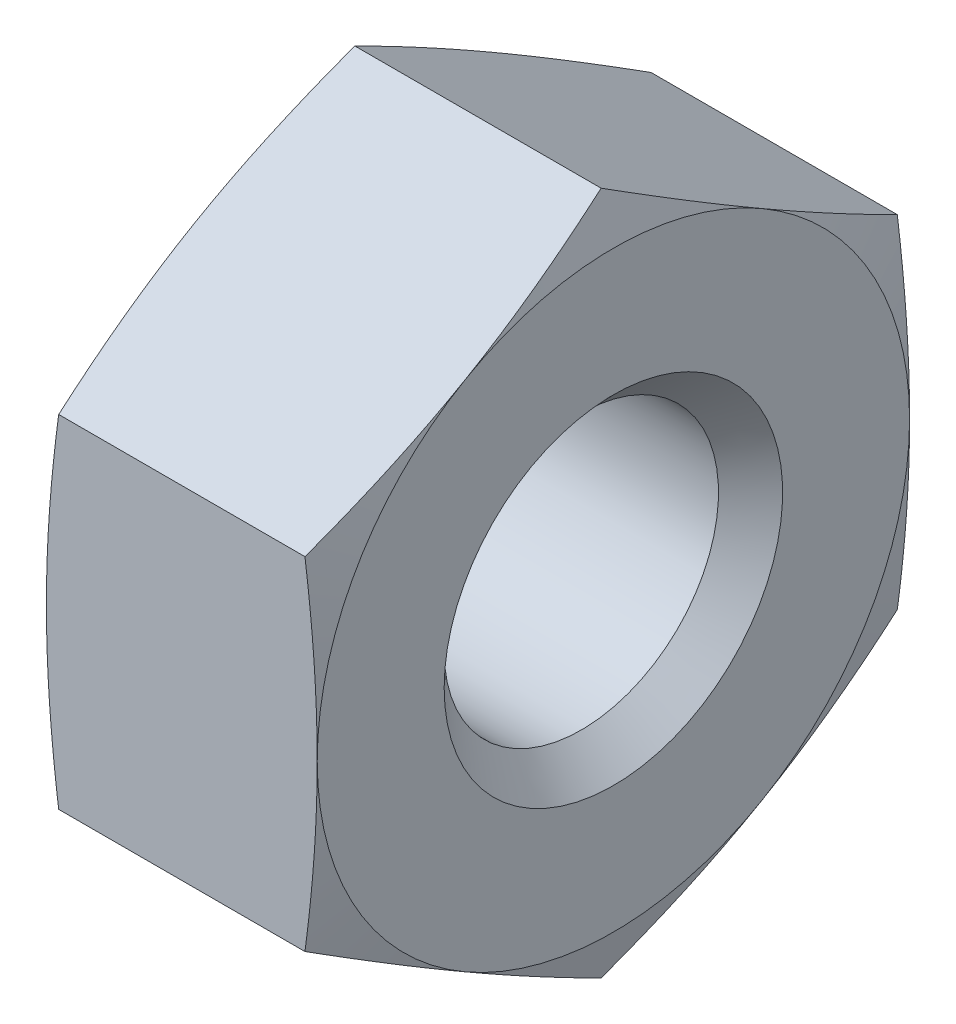
ISO-10303-21;
HEADER;
FILE_DESCRIPTION(('STEP AP214'),'2;1');
FILE_NAME('part.step','',(''),(''),'','','');
FILE_SCHEMA(('AUTOMOTIVE_DESIGN { 1 0 10303 214 1 1 1 1 }'));
ENDSEC;
DATA;
#1=APPLICATION_CONTEXT('core data for automotive mechanical design processes');
#2=APPLICATION_PROTOCOL_DEFINITION('international standard','automotive_design',2000,#1);
#3=PRODUCT_CONTEXT('',#1,'mechanical');
#4=PRODUCT('Part','Part','',(#3));
#5=PRODUCT_RELATED_PRODUCT_CATEGORY('part','',(#4));
#6=PRODUCT_DEFINITION_FORMATION('','',#4);
#7=PRODUCT_DEFINITION_CONTEXT('part definition',#1,'design');
#8=PRODUCT_DEFINITION('design','',#6,#7);
#9=PRODUCT_DEFINITION_SHAPE('','',#8);
#10=(LENGTH_UNIT() NAMED_UNIT(*) SI_UNIT(.MILLI.,.METRE.));
#11=(NAMED_UNIT(*) PLANE_ANGLE_UNIT() SI_UNIT($,.RADIAN.));
#12=(NAMED_UNIT(*) SI_UNIT($,.STERADIAN.) SOLID_ANGLE_UNIT());
#13=UNCERTAINTY_MEASURE_WITH_UNIT(LENGTH_MEASURE(1.E-05),#10,'distance_accuracy_value','');
#14=(GEOMETRIC_REPRESENTATION_CONTEXT(3) GLOBAL_UNCERTAINTY_ASSIGNED_CONTEXT((#13)) GLOBAL_UNIT_ASSIGNED_CONTEXT((#10,
#11,#12)) REPRESENTATION_CONTEXT('',''));
#15=CARTESIAN_POINT('',(0.,0.,0.));
#16=DIRECTION('',(0.,0.,1.));
#17=DIRECTION('',(1.,0.,0.));
#18=AXIS2_PLACEMENT_3D('',#15,#16,#17);
#19=CARTESIAN_POINT('',(-1.41243556529821,0.,0.));
#20=DIRECTION('',(1.,0.,0.));
#21=DIRECTION('',(0.,0.,-1.));
#22=AXIS2_PLACEMENT_3D('',#19,#20,#21);
#23=CONICAL_SURFACE('',#22,4.2,1.30899693899575);
#24=CARTESIAN_POINT('',(-0.825774080769455,-5.3455661320004,-3.5));
#25=CARTESIAN_POINT('',(-0.861360202240099,-5.18678114563824,-3.5));
#26=CARTESIAN_POINT('',(-0.896510445753242,-5.02789691141848,-3.5));
#27=CARTESIAN_POINT('',(-0.965705585660819,-4.70988103803526,-3.5));
#28=CARTESIAN_POINT('',(-0.9997504343165,-4.55074938849684,-3.5));
#29=CARTESIAN_POINT('',(-1.06653082110248,-4.23204722615718,-3.5));
#30=CARTESIAN_POINT('',(-1.09926504210674,-4.07247643597971,-3.5));
#31=CARTESIAN_POINT('',(-1.16306421152616,-3.75300326246381,-3.5));
#32=CARTESIAN_POINT('',(-1.19412917402961,-3.5931008819358,-3.5));
#33=CARTESIAN_POINT('',(-1.28378237158869,-3.11536923669083,-3.5));
#34=CARTESIAN_POINT('',(-1.33937462224755,-2.7969665823393,-3.5));
#35=CARTESIAN_POINT('',(-1.43824247623802,-2.15821816166541,-3.5));
#36=CARTESIAN_POINT('',(-1.48152020199654,-1.83787273991409,-3.5));
#37=CARTESIAN_POINT('',(-1.53305506921513,-1.35406191552193,-3.5));
#38=CARTESIAN_POINT('',(-1.54804894029897,-1.19131720521593,-3.5));
#39=CARTESIAN_POINT('',(-1.57266491038951,-0.865417075062547,-3.5));
#40=CARTESIAN_POINT('',(-1.58228713258986,-0.702261664720382,-3.5));
#41=CARTESIAN_POINT('',(-1.59560015595098,-0.375778787142295,-3.5));
#42=CARTESIAN_POINT('',(-1.59929365257278,-0.212451431896808,-3.5));
#43=CARTESIAN_POINT('',(-1.60052170001637,0.114226872120972,-3.5));
#44=CARTESIAN_POINT('',(-1.59805625614729,0.277577820872805,-3.5));
#45=CARTESIAN_POINT('',(-1.58710536677282,0.604665466025193,-3.5));
#46=CARTESIAN_POINT('',(-1.57859816890971,0.768401419243445,-3.5));
#47=CARTESIAN_POINT('',(-1.55604871274712,1.0954934251131,-3.5));
#48=CARTESIAN_POINT('',(-1.5420061543352,1.25884945668304,-3.5));
#49=CARTESIAN_POINT('',(-1.50909696140663,1.5851727966074,-3.5));
#50=CARTESIAN_POINT('',(-1.49022725581786,1.74813979058414,-3.5));
#51=CARTESIAN_POINT('',(-1.44844379186519,2.07354796221386,-3.5));
#52=CARTESIAN_POINT('',(-1.42553002080452,2.23598913821436,-3.5));
#53=CARTESIAN_POINT('',(-1.35510376185541,2.70107424154032,-3.5));
#54=CARTESIAN_POINT('',(-1.30349609986563,3.00309502608456,-3.5));
#55=CARTESIAN_POINT('',(-1.19263699683484,3.60573006421075,-3.5));
#56=CARTESIAN_POINT('',(-1.13338458654066,3.90634413442305,-3.5));
#57=CARTESIAN_POINT('',(-1.00974779112105,4.50658311308096,-3.5));
#58=CARTESIAN_POINT('',(-0.945362163628684,4.80620776367716,-3.5));
#59=CARTESIAN_POINT('',(-0.813098909194716,5.4046608471849,-3.5));
#60=CARTESIAN_POINT('',(-0.745221486521148,5.70348932559883,-3.5));
#61=CARTESIAN_POINT('',(-0.607691774971723,6.29764252059795,-3.5));
#62=CARTESIAN_POINT('',(-0.538063481001438,6.59297281204217,-3.5));
#63=CARTESIAN_POINT('',(-0.397063271598534,7.18322142520436,-3.5));
#64=CARTESIAN_POINT('',(-0.325691324401068,7.47813973931354,-3.5));
#65=CARTESIAN_POINT('',(-0.1817484400772,8.06729730832213,-3.5));
#66=CARTESIAN_POINT('',(-0.109179091229992,8.36153695209043,-3.5));
#67=CARTESIAN_POINT('',(0.0369505240143286,8.94975993868972,-3.5));
#68=CARTESIAN_POINT('',(0.110510757631055,9.24374328965846,-3.5));
#69=CARTESIAN_POINT('',(0.184421960074827,9.53763731936475,-3.5));
#70=B_SPLINE_CURVE_WITH_KNOTS('',3,(#24,#25,#26,#27,#28,#29,#30,#31,#32,#33,#34,#35,#36,#37,#38,
#39,#40,#41,#42,#43,#44,#45,#46,#47,#48,#49,#50,#51,#52,#53,#54,#55,#56,#57,#58,#59,#60,#61,#62,
#63,#64,#65,#66,#67,#68,#69),.UNSPECIFIED.,.F.,.F.,(4,2,2,2,2,2,2,2,2,2,2,2,2,2,2,2,2,2,2,2,2,2,
4),(0.,0.488173047170685,0.976367149132463,1.46504014431117,1.95370901451417,2.92322875453118,
3.89258129500769,4.38280901112369,4.87302548387088,5.36301901932391,5.85301213239303,
6.34477838866378,6.83657131085366,7.32867789741848,7.82078602903244,8.73980806610427,
9.65894673775297,10.5783085432182,11.4976166275648,12.40789115114,13.3181822699437,
14.2273500606709,15.1364878478763),.UNSPECIFIED.);
#71=CARTESIAN_POINT('',(-1.45491840485417,-2.02072594216369,-3.5));
#72=VERTEX_POINT('',#71);
#73=CARTESIAN_POINT('',(-1.6,0.,-3.5));
#74=VERTEX_POINT('',#73);
#75=EDGE_CURVE('E202',#72,#74,#70,.T.);
#76=ORIENTED_EDGE('',*,*,#75,.F.);
#77=CARTESIAN_POINT('',(-1.45488746342053,-4.04156735438122,0.000200000000000065));
#78=CARTESIAN_POINT('',(-1.47738559382201,-3.95764212282385,-0.145162765094347));
#79=CARTESIAN_POINT('',(-1.49781025450598,-3.87356471593575,-0.290789105593173));
#80=CARTESIAN_POINT('',(-1.53369455339474,-3.70511294932748,-0.582556123983438));
#81=CARTESIAN_POINT('',(-1.54915217450553,-3.62073848299856,-0.728696986526636));
#82=CARTESIAN_POINT('',(-1.57419991225358,-3.45220420868617,-1.02060691245244));
#83=CARTESIAN_POINT('',(-1.58381990209048,-3.3680455405573,-1.16637400154898));
#84=CARTESIAN_POINT('',(-1.59671933246686,-3.19962087008055,-1.45809408806274));
#85=CARTESIAN_POINT('',(-1.6,-3.11535489166305,-1.60404704403137));
#86=CARTESIAN_POINT('',(-1.6,-2.94682293482803,-1.89595295596863));
#87=CARTESIAN_POINT('',(-1.59671933246686,-2.86255695641052,-2.04190591193726));
#88=CARTESIAN_POINT('',(-1.58381990209048,-2.69413228593377,-2.33362599845102));
#89=CARTESIAN_POINT('',(-1.57419991225358,-2.6099736178049,-2.47939308754755));
#90=CARTESIAN_POINT('',(-1.54915217450552,-2.44143934349251,-2.77130301347336));
#91=CARTESIAN_POINT('',(-1.53369455339473,-2.35706487716359,-2.91744387601656));
#92=CARTESIAN_POINT('',(-1.49781025450598,-2.18861311055532,-3.20921089440683));
#93=CARTESIAN_POINT('',(-1.47738559382201,-2.10453570366722,-3.35483723490565));
#94=CARTESIAN_POINT('',(-1.45488746342053,-2.02061047210985,-3.5002));
#95=B_SPLINE_CURVE_WITH_KNOTS('',3,(#77,#78,#79,#80,#81,#82,#83,#84,#85,#86,#87,#88,#89,#90,#91,
#92,#93,#94),.UNSPECIFIED.,.F.,.F.,(4,2,2,2,2,2,2,2,4),(0.,0.508081243376833,1.01636855642799,
1.52203235492776,2.02759827097034,2.53316418701292,3.03882798551268,3.54711529856384,
4.05519654194067),.UNSPECIFIED.);
#96=CARTESIAN_POINT('',(-1.6,-3.03108891324554,-1.75));
#97=VERTEX_POINT('',#96);
#98=EDGE_CURVE('E182',#97,#72,#95,.T.);
#99=ORIENTED_EDGE('',*,*,#98,.F.);
#100=CARTESIAN_POINT('',(-1.6,0.,0.));
#101=DIRECTION('',(-1.,0.,0.));
#102=DIRECTION('',(0.,0.,1.));
#103=AXIS2_PLACEMENT_3D('',#100,#101,#102);
#104=CIRCLE('',#103,3.5);
#105=EDGE_CURVE('E279',#74,#97,#104,.T.);
#106=ORIENTED_EDGE('',*,*,#105,.F.);
#107=EDGE_LOOP('',(#76,#99,#106));
#108=FACE_BOUND('',#107,.T.);
#109=ADVANCED_FACE('F36',(#108),#23,.T.);
#110=CARTESIAN_POINT('',(-1.45491840485417,2.02072594216369,-3.5));
#111=VERTEX_POINT('',#110);
#112=EDGE_CURVE('E189',#74,#111,#70,.T.);
#113=ORIENTED_EDGE('',*,*,#112,.F.);
#114=CARTESIAN_POINT('',(-1.6,3.03108891324554,-1.75));
#115=VERTEX_POINT('',#114);
#116=EDGE_CURVE('E280',#115,#74,#104,.T.);
#117=ORIENTED_EDGE('',*,*,#116,.F.);
#118=CARTESIAN_POINT('',(-1.45488746342053,2.02061047210985,-3.5002));
#119=CARTESIAN_POINT('',(-1.47738559382201,2.10453570366722,-3.35483723490565));
#120=CARTESIAN_POINT('',(-1.49781025450598,2.18861311055532,-3.20921089440683));
#121=CARTESIAN_POINT('',(-1.53369455339473,2.35706487716359,-2.91744387601656));
#122=CARTESIAN_POINT('',(-1.54915217450552,2.44143934349251,-2.77130301347336));
#123=CARTESIAN_POINT('',(-1.57419991225358,2.6099736178049,-2.47939308754755));
#124=CARTESIAN_POINT('',(-1.58381990209048,2.69413228593377,-2.33362599845102));
#125=CARTESIAN_POINT('',(-1.59671933246686,2.86255695641052,-2.04190591193726));
#126=CARTESIAN_POINT('',(-1.6,2.94682293482803,-1.89595295596863));
#127=CARTESIAN_POINT('',(-1.6,3.11535489166304,-1.60404704403137));
#128=CARTESIAN_POINT('',(-1.59671933246686,3.19962087008055,-1.45809408806274));
#129=CARTESIAN_POINT('',(-1.58381990209048,3.3680455405573,-1.16637400154898));
#130=CARTESIAN_POINT('',(-1.57419991225358,3.45220420868617,-1.02060691245244));
#131=CARTESIAN_POINT('',(-1.54915217450553,3.62073848299856,-0.728696986526636));
#132=CARTESIAN_POINT('',(-1.53369455339473,3.70511294932748,-0.582556123983438));
#133=CARTESIAN_POINT('',(-1.49781025450598,3.87356471593575,-0.290789105593172));
#134=CARTESIAN_POINT('',(-1.47738559382201,3.95764212282385,-0.145162765094346));
#135=CARTESIAN_POINT('',(-1.45488746342053,4.04156735438122,0.000200000000000213));
#136=B_SPLINE_CURVE_WITH_KNOTS('',3,(#118,#119,#120,#121,#122,#123,#124,#125,#126,#127,#128,
#129,#130,#131,#132,#133,#134,#135),.UNSPECIFIED.,.F.,.F.,(4,2,2,2,2,2,2,2,4),(0.,
0.508081243376834,1.016368556428,1.52203235492776,2.02759827097034,2.53316418701292,
3.03882798551268,3.54711529856384,4.05519654194067),.UNSPECIFIED.);
#137=EDGE_CURVE('E141',#111,#115,#136,.T.);
#138=ORIENTED_EDGE('',*,*,#137,.F.);
#139=EDGE_LOOP('',(#113,#117,#138));
#140=FACE_BOUND('',#139,.T.);
#141=ADVANCED_FACE('F171',(#140),#23,.T.);
#142=CARTESIAN_POINT('',(-1.45491840485417,4.04145188432738,0.));
#143=VERTEX_POINT('',#142);
#144=EDGE_CURVE('E196',#115,#143,#136,.T.);
#145=ORIENTED_EDGE('',*,*,#144,.F.);
#146=CARTESIAN_POINT('',(-1.6,3.03108891324554,1.75));
#147=VERTEX_POINT('',#146);
#148=EDGE_CURVE('E282',#147,#115,#104,.T.);
#149=ORIENTED_EDGE('',*,*,#148,.F.);
#150=CARTESIAN_POINT('',(-1.45488746342053,4.04156735438122,-0.000200000000000065));
#151=CARTESIAN_POINT('',(-1.47738559382201,3.95764212282385,0.145162765094347));
#152=CARTESIAN_POINT('',(-1.49781025450598,3.87356471593575,0.290789105593173));
#153=CARTESIAN_POINT('',(-1.53369455339474,3.70511294932748,0.582556123983438));
#154=CARTESIAN_POINT('',(-1.54915217450553,3.62073848299856,0.728696986526636));
#155=CARTESIAN_POINT('',(-1.57419991225358,3.45220420868617,1.02060691245244));
#156=CARTESIAN_POINT('',(-1.58381990209048,3.3680455405573,1.16637400154898));
#157=CARTESIAN_POINT('',(-1.59671933246686,3.19962087008055,1.45809408806274));
#158=CARTESIAN_POINT('',(-1.6,3.11535489166305,1.60404704403137));
#159=CARTESIAN_POINT('',(-1.6,2.94682293482803,1.89595295596863));
#160=CARTESIAN_POINT('',(-1.59671933246686,2.86255695641052,2.04190591193726));
#161=CARTESIAN_POINT('',(-1.58381990209048,2.69413228593377,2.33362599845102));
#162=CARTESIAN_POINT('',(-1.57419991225358,2.6099736178049,2.47939308754755));
#163=CARTESIAN_POINT('',(-1.54915217450552,2.44143934349251,2.77130301347336));
#164=CARTESIAN_POINT('',(-1.53369455339473,2.35706487716359,2.91744387601656));
#165=CARTESIAN_POINT('',(-1.49781025450598,2.18861311055532,3.20921089440683));
#166=CARTESIAN_POINT('',(-1.47738559382201,2.10453570366722,3.35483723490565));
#167=CARTESIAN_POINT('',(-1.45488746342053,2.02061047210985,3.5002));
#168=B_SPLINE_CURVE_WITH_KNOTS('',3,(#150,#151,#152,#153,#154,#155,#156,#157,#158,#159,#160,
#161,#162,#163,#164,#165,#166,#167),.UNSPECIFIED.,.F.,.F.,(4,2,2,2,2,2,2,2,4),(0.,
0.508081243376833,1.01636855642799,1.52203235492776,2.02759827097034,2.53316418701292,
3.03882798551268,3.54711529856384,4.05519654194067),.UNSPECIFIED.);
#169=EDGE_CURVE('E137',#143,#147,#168,.T.);
#170=ORIENTED_EDGE('',*,*,#169,.F.);
#171=EDGE_LOOP('',(#145,#149,#170));
#172=FACE_BOUND('',#171,.T.);
#173=ADVANCED_FACE('F351',(#172),#23,.T.);
#174=CARTESIAN_POINT('',(-1.45491840485417,-4.04145188432738,0.));
#175=VERTEX_POINT('',#174);
#176=EDGE_CURVE('E270',#175,#97,#95,.T.);
#177=ORIENTED_EDGE('',*,*,#176,.F.);
#178=CARTESIAN_POINT('',(-1.45488746342053,-2.02061047210985,3.5002));
#179=CARTESIAN_POINT('',(-1.47738559382201,-2.10453570366722,3.35483723490565));
#180=CARTESIAN_POINT('',(-1.49781025450598,-2.18861311055532,3.20921089440683));
#181=CARTESIAN_POINT('',(-1.53369455339473,-2.35706487716359,2.91744387601656));
#182=CARTESIAN_POINT('',(-1.54915217450552,-2.44143934349251,2.77130301347336));
#183=CARTESIAN_POINT('',(-1.57419991225358,-2.6099736178049,2.47939308754755));
#184=CARTESIAN_POINT('',(-1.58381990209048,-2.69413228593377,2.33362599845102));
#185=CARTESIAN_POINT('',(-1.59671933246686,-2.86255695641052,2.04190591193726));
#186=CARTESIAN_POINT('',(-1.6,-2.94682293482803,1.89595295596863));
#187=CARTESIAN_POINT('',(-1.6,-3.11535489166304,1.60404704403137));
#188=CARTESIAN_POINT('',(-1.59671933246686,-3.19962087008055,1.45809408806274));
#189=CARTESIAN_POINT('',(-1.58381990209048,-3.3680455405573,1.16637400154898));
#190=CARTESIAN_POINT('',(-1.57419991225358,-3.45220420868617,1.02060691245244));
#191=CARTESIAN_POINT('',(-1.54915217450553,-3.62073848299856,0.728696986526636));
#192=CARTESIAN_POINT('',(-1.53369455339473,-3.70511294932748,0.582556123983438));
#193=CARTESIAN_POINT('',(-1.49781025450598,-3.87356471593575,0.290789105593172));
#194=CARTESIAN_POINT('',(-1.47738559382201,-3.95764212282385,0.145162765094346));
#195=CARTESIAN_POINT('',(-1.45488746342053,-4.04156735438122,-0.000200000000000213));
#196=B_SPLINE_CURVE_WITH_KNOTS('',3,(#178,#179,#180,#181,#182,#183,#184,#185,#186,#187,#188,
#189,#190,#191,#192,#193,#194,#195),.UNSPECIFIED.,.F.,.F.,(4,2,2,2,2,2,2,2,4),(0.,
0.508081243376834,1.016368556428,1.52203235492776,2.02759827097034,2.53316418701292,
3.03882798551268,3.54711529856384,4.05519654194067),.UNSPECIFIED.);
#197=CARTESIAN_POINT('',(-1.6,-3.03108891324554,1.75));
#198=VERTEX_POINT('',#197);
#199=EDGE_CURVE('E150',#198,#175,#196,.T.);
#200=ORIENTED_EDGE('',*,*,#199,.F.);
#201=EDGE_CURVE('E268',#97,#198,#104,.T.);
#202=ORIENTED_EDGE('',*,*,#201,.F.);
#203=EDGE_LOOP('',(#177,#200,#202));
#204=FACE_BOUND('',#203,.T.);
#205=ADVANCED_FACE('F266',(#204),#23,.T.);
#206=CARTESIAN_POINT('',(-1.45491840485417,2.02072594216369,3.5));
#207=VERTEX_POINT('',#206);
#208=EDGE_CURVE('E131',#147,#207,#168,.T.);
#209=ORIENTED_EDGE('',*,*,#208,.F.);
#210=CARTESIAN_POINT('',(-1.6,0.,3.5));
#211=VERTEX_POINT('',#210);
#212=EDGE_CURVE('E149',#211,#147,#104,.T.);
#213=ORIENTED_EDGE('',*,*,#212,.F.);
#214=CARTESIAN_POINT('',(-0.825774080769455,-5.3455661320004,3.5));
#215=CARTESIAN_POINT('',(-0.861360202240099,-5.18678114563824,3.5));
#216=CARTESIAN_POINT('',(-0.896510445753242,-5.02789691141848,3.5));
#217=CARTESIAN_POINT('',(-0.965705585660819,-4.70988103803526,3.5));
#218=CARTESIAN_POINT('',(-0.9997504343165,-4.55074938849684,3.5));
#219=CARTESIAN_POINT('',(-1.06653082110248,-4.23204722615718,3.5));
#220=CARTESIAN_POINT('',(-1.09926504210674,-4.07247643597971,3.5));
#221=CARTESIAN_POINT('',(-1.16306421152616,-3.75300326246381,3.5));
#222=CARTESIAN_POINT('',(-1.19412917402961,-3.5931008819358,3.5));
#223=CARTESIAN_POINT('',(-1.28378237158869,-3.11536923669083,3.5));
#224=CARTESIAN_POINT('',(-1.33937462224755,-2.7969665823393,3.5));
#225=CARTESIAN_POINT('',(-1.43824247623802,-2.15821816166541,3.5));
#226=CARTESIAN_POINT('',(-1.48152020199654,-1.83787273991409,3.5));
#227=CARTESIAN_POINT('',(-1.53305506921513,-1.35406191552193,3.5));
#228=CARTESIAN_POINT('',(-1.54804894029897,-1.19131720521593,3.5));
#229=CARTESIAN_POINT('',(-1.57266491038951,-0.865417075062547,3.5));
#230=CARTESIAN_POINT('',(-1.58228713258986,-0.702261664720382,3.5));
#231=CARTESIAN_POINT('',(-1.59560015595098,-0.375778787142295,3.5));
#232=CARTESIAN_POINT('',(-1.59929365257278,-0.212451431896808,3.5));
#233=CARTESIAN_POINT('',(-1.60052170001637,0.114226872120972,3.5));
#234=CARTESIAN_POINT('',(-1.59805625614729,0.277577820872805,3.5));
#235=CARTESIAN_POINT('',(-1.58710536677282,0.604665466025193,3.5));
#236=CARTESIAN_POINT('',(-1.57859816890971,0.768401419243445,3.5));
#237=CARTESIAN_POINT('',(-1.55604871274712,1.0954934251131,3.5));
#238=CARTESIAN_POINT('',(-1.5420061543352,1.25884945668304,3.5));
#239=CARTESIAN_POINT('',(-1.50909696140663,1.5851727966074,3.5));
#240=CARTESIAN_POINT('',(-1.49022725581786,1.74813979058414,3.5));
#241=CARTESIAN_POINT('',(-1.44844379186519,2.07354796221386,3.5));
#242=CARTESIAN_POINT('',(-1.42553002080452,2.23598913821436,3.5));
#243=CARTESIAN_POINT('',(-1.35510376185541,2.70107424154032,3.5));
#244=CARTESIAN_POINT('',(-1.30349609986563,3.00309502608456,3.5));
#245=CARTESIAN_POINT('',(-1.19263699683484,3.60573006421075,3.5));
#246=CARTESIAN_POINT('',(-1.13338458654066,3.90634413442305,3.5));
#247=CARTESIAN_POINT('',(-1.00974779112105,4.50658311308096,3.5));
#248=CARTESIAN_POINT('',(-0.945362163628684,4.80620776367716,3.5));
#249=CARTESIAN_POINT('',(-0.813098909194716,5.4046608471849,3.5));
#250=CARTESIAN_POINT('',(-0.745221486521148,5.70348932559883,3.5));
#251=CARTESIAN_POINT('',(-0.607691774971723,6.29764252059795,3.5));
#252=CARTESIAN_POINT('',(-0.538063481001438,6.59297281204217,3.5));
#253=CARTESIAN_POINT('',(-0.397063271598534,7.18322142520436,3.5));
#254=CARTESIAN_POINT('',(-0.325691324401068,7.47813973931354,3.5));
#255=CARTESIAN_POINT('',(-0.1817484400772,8.06729730832213,3.5));
#256=CARTESIAN_POINT('',(-0.109179091229992,8.36153695209043,3.5));
#257=CARTESIAN_POINT('',(0.0369505240143286,8.94975993868972,3.5));
#258=CARTESIAN_POINT('',(0.110510757631055,9.24374328965846,3.5));
#259=CARTESIAN_POINT('',(0.184421960074827,9.53763731936475,3.5));
#260=B_SPLINE_CURVE_WITH_KNOTS('',3,(#214,#215,#216,#217,#218,#219,#220,#221,#222,#223,#224,
#225,#226,#227,#228,#229,#230,#231,#232,#233,#234,#235,#236,#237,#238,#239,#240,#241,#242,#243,
#244,#245,#246,#247,#248,#249,#250,#251,#252,#253,#254,#255,#256,#257,#258,#259),.UNSPECIFIED.,
.F.,.F.,(4,2,2,2,2,2,2,2,2,2,2,2,2,2,2,2,2,2,2,2,2,2,4),(0.,0.488173047170685,0.976367149132463,
1.46504014431117,1.95370901451417,2.92322875453118,3.89258129500769,4.38280901112369,
4.87302548387088,5.36301901932391,5.85301213239303,6.34477838866378,6.83657131085366,
7.32867789741848,7.82078602903244,8.73980806610427,9.65894673775297,10.5783085432182,
11.4976166275648,12.40789115114,13.3181822699437,14.2273500606709,15.1364878478763),.UNSPECIFIED.);
#261=EDGE_CURVE('E57',#207,#211,#260,.F.);
#262=ORIENTED_EDGE('',*,*,#261,.F.);
#263=EDGE_LOOP('',(#209,#213,#262));
#264=FACE_BOUND('',#263,.T.);
#265=ADVANCED_FACE('F147',(#264),#23,.T.);
#266=CARTESIAN_POINT('',(-1.45491840485417,-2.02072594216369,3.5));
#267=VERTEX_POINT('',#266);
#268=EDGE_CURVE('E153',#267,#198,#196,.T.);
#269=ORIENTED_EDGE('',*,*,#268,.F.);
#270=EDGE_CURVE('E151',#211,#267,#260,.F.);
#271=ORIENTED_EDGE('',*,*,#270,.F.);
#272=EDGE_CURVE('E272',#198,#211,#104,.T.);
#273=ORIENTED_EDGE('',*,*,#272,.F.);
#274=EDGE_LOOP('',(#269,#271,#273));
#275=FACE_BOUND('',#274,.T.);
#276=ADVANCED_FACE('F173',(#275),#23,.T.);
#277=CARTESIAN_POINT('',(1.6,0.,0.));
#278=DIRECTION('',(-1.,0.,0.));
#279=DIRECTION('',(0.,0.,1.));
#280=AXIS2_PLACEMENT_3D('',#277,#278,#279);
#281=CONICAL_SURFACE('',#280,3.5,1.30899693899575);
#282=CARTESIAN_POINT('',(1.45488746342053,2.02061047210985,3.5002));
#283=CARTESIAN_POINT('',(1.47738559382201,2.10453570366722,3.35483723490565));
#284=CARTESIAN_POINT('',(1.49781025450598,2.18861311055532,3.20921089440683));
#285=CARTESIAN_POINT('',(1.53369455339473,2.35706487716359,2.91744387601656));
#286=CARTESIAN_POINT('',(1.54915217450553,2.44143934349251,2.77130301347336));
#287=CARTESIAN_POINT('',(1.57419991225358,2.6099736178049,2.47939308754755));
#288=CARTESIAN_POINT('',(1.58381990209048,2.69413228593377,2.33362599845102));
#289=CARTESIAN_POINT('',(1.59671933246686,2.86255695641052,2.04190591193726));
#290=CARTESIAN_POINT('',(1.6,2.94682293482803,1.89595295596863));
#291=CARTESIAN_POINT('',(1.6,3.11535489166305,1.60404704403137));
#292=CARTESIAN_POINT('',(1.59671933246686,3.19962087008055,1.45809408806274));
#293=CARTESIAN_POINT('',(1.58381990209048,3.3680455405573,1.16637400154898));
#294=CARTESIAN_POINT('',(1.57419991225358,3.45220420868617,1.02060691245245));
#295=CARTESIAN_POINT('',(1.54915217450553,3.62073848299856,0.728696986526637));
#296=CARTESIAN_POINT('',(1.53369455339474,3.70511294932748,0.582556123983438));
#297=CARTESIAN_POINT('',(1.49781025450598,3.87356471593575,0.290789105593173));
#298=CARTESIAN_POINT('',(1.47738559382201,3.95764212282385,0.145162765094347));
#299=CARTESIAN_POINT('',(1.45488746342053,4.04156735438122,-0.000199999999999612));
#300=B_SPLINE_CURVE_WITH_KNOTS('',3,(#282,#283,#284,#285,#286,#287,#288,#289,#290,#291,#292,
#293,#294,#295,#296,#297,#298,#299),.UNSPECIFIED.,.F.,.F.,(4,2,2,2,2,2,2,2,4),(0.,
0.508081243376834,1.01636855642799,1.52203235492776,2.02759827097034,2.53316418701292,
3.03882798551268,3.54711529856384,4.05519654194067),.UNSPECIFIED.);
#301=CARTESIAN_POINT('',(1.45491840485417,2.02072594216369,3.5));
#302=VERTEX_POINT('',#301);
#303=CARTESIAN_POINT('',(1.6,3.03108891324554,1.75));
#304=VERTEX_POINT('',#303);
#305=EDGE_CURVE('E11',#302,#304,#300,.T.);
#306=ORIENTED_EDGE('',*,*,#305,.F.);
#307=CARTESIAN_POINT('',(0.825774080769454,-5.3455661320004,3.5));
#308=CARTESIAN_POINT('',(0.861360202240099,-5.18678114563824,3.5));
#309=CARTESIAN_POINT('',(0.896510445753242,-5.02789691141848,3.5));
#310=CARTESIAN_POINT('',(0.965705585660819,-4.70988103803526,3.5));
#311=CARTESIAN_POINT('',(0.9997504343165,-4.55074938849684,3.5));
#312=CARTESIAN_POINT('',(1.06653082110248,-4.23204722615718,3.5));
#313=CARTESIAN_POINT('',(1.09926504210674,-4.07247643597971,3.5));
#314=CARTESIAN_POINT('',(1.16306421152616,-3.75300326246381,3.5));
#315=CARTESIAN_POINT('',(1.19412917402961,-3.5931008819358,3.5));
#316=CARTESIAN_POINT('',(1.28378237158869,-3.11536923669083,3.5));
#317=CARTESIAN_POINT('',(1.33937462224755,-2.7969665823393,3.5));
#318=CARTESIAN_POINT('',(1.43824247623802,-2.15821816166541,3.5));
#319=CARTESIAN_POINT('',(1.48152020199654,-1.83787273991409,3.5));
#320=CARTESIAN_POINT('',(1.53305506921513,-1.35406191552193,3.5));
#321=CARTESIAN_POINT('',(1.54804894029897,-1.19131720521593,3.5));
#322=CARTESIAN_POINT('',(1.57266491038951,-0.865417075062548,3.5));
#323=CARTESIAN_POINT('',(1.58228713258986,-0.702261664720382,3.5));
#324=CARTESIAN_POINT('',(1.59560015595098,-0.375778787142295,3.5));
#325=CARTESIAN_POINT('',(1.59929365257278,-0.212451431896808,3.5));
#326=CARTESIAN_POINT('',(1.60052170001637,0.114226872120972,3.5));
#327=CARTESIAN_POINT('',(1.59805625614729,0.277577820872805,3.5));
#328=CARTESIAN_POINT('',(1.58710536677282,0.604665466025193,3.5));
#329=CARTESIAN_POINT('',(1.57859816890971,0.768401419243445,3.5));
#330=CARTESIAN_POINT('',(1.55604871274712,1.0954934251131,3.5));
#331=CARTESIAN_POINT('',(1.54200615433519,1.25884945668304,3.5));
#332=CARTESIAN_POINT('',(1.50909696140663,1.5851727966074,3.5));
#333=CARTESIAN_POINT('',(1.49022725581786,1.74813979058414,3.5));
#334=CARTESIAN_POINT('',(1.44844379186519,2.07354796221386,3.5));
#335=CARTESIAN_POINT('',(1.42553002080452,2.23598913821436,3.5));
#336=CARTESIAN_POINT('',(1.35510376185541,2.70107424154031,3.5));
#337=CARTESIAN_POINT('',(1.30349609986563,3.00309502608456,3.5));
#338=CARTESIAN_POINT('',(1.19263699683484,3.60573006421074,3.5));
#339=CARTESIAN_POINT('',(1.13338458654066,3.90634413442305,3.5));
#340=CARTESIAN_POINT('',(1.00974779112105,4.50658311308096,3.5));
#341=CARTESIAN_POINT('',(0.945362163628684,4.80620776367716,3.5));
#342=CARTESIAN_POINT('',(0.813098909194716,5.4046608471849,3.5));
#343=CARTESIAN_POINT('',(0.745221486521148,5.70348932559882,3.5));
#344=CARTESIAN_POINT('',(0.607691774971723,6.29764252059795,3.5));
#345=CARTESIAN_POINT('',(0.538063481001439,6.59297281204217,3.5));
#346=CARTESIAN_POINT('',(0.397063271598534,7.18322142520436,3.5));
#347=CARTESIAN_POINT('',(0.325691324401068,7.47813973931354,3.5));
#348=CARTESIAN_POINT('',(0.1817484400772,8.06729730832213,3.5));
#349=CARTESIAN_POINT('',(0.109179091229992,8.36153695209043,3.5));
#350=CARTESIAN_POINT('',(-0.0369505240143283,8.94975993868972,3.5));
#351=CARTESIAN_POINT('',(-0.110510757631055,9.24374328965846,3.5));
#352=CARTESIAN_POINT('',(-0.184421960074828,9.53763731936475,3.5));
#353=B_SPLINE_CURVE_WITH_KNOTS('',3,(#307,#308,#309,#310,#311,#312,#313,#314,#315,#316,#317,
#318,#319,#320,#321,#322,#323,#324,#325,#326,#327,#328,#329,#330,#331,#332,#333,#334,#335,#336,
#337,#338,#339,#340,#341,#342,#343,#344,#345,#346,#347,#348,#349,#350,#351,#352),.UNSPECIFIED.,
.F.,.F.,(4,2,2,2,2,2,2,2,2,2,2,2,2,2,2,2,2,2,2,2,2,2,4),(0.,0.488173047170685,0.976367149132463,
1.46504014431117,1.95370901451417,2.92322875453118,3.89258129500769,4.38280901112369,
4.87302548387087,5.36301901932391,5.85301213239303,6.34477838866378,6.83657131085366,
7.32867789741848,7.82078602903244,8.73980806610426,9.65894673775296,10.5783085432182,
11.4976166275648,12.40789115114,13.3181822699437,14.2273500606709,15.1364878478763),.UNSPECIFIED.);
#354=CARTESIAN_POINT('',(1.6,0.,3.5));
#355=VERTEX_POINT('',#354);
#356=EDGE_CURVE('E144',#355,#302,#353,.T.);
#357=ORIENTED_EDGE('',*,*,#356,.F.);
#358=CARTESIAN_POINT('',(1.6,0.,0.));
#359=DIRECTION('',(-1.,0.,0.));
#360=DIRECTION('',(0.,0.,1.));
#361=AXIS2_PLACEMENT_3D('',#358,#359,#360);
#362=CIRCLE('',#361,3.5);
#363=EDGE_CURVE('E274',#355,#304,#362,.T.);
#364=ORIENTED_EDGE('',*,*,#363,.T.);
#365=EDGE_LOOP('',(#306,#357,#364));
#366=FACE_BOUND('',#365,.T.);
#367=ADVANCED_FACE('F174',(#366),#281,.T.);
#368=CARTESIAN_POINT('',(1.45491840485417,4.04145188432738,0.));
#369=VERTEX_POINT('',#368);
#370=EDGE_CURVE('E40',#304,#369,#300,.T.);
#371=ORIENTED_EDGE('',*,*,#370,.F.);
#372=CARTESIAN_POINT('',(1.6,3.03108891324554,-1.75));
#373=VERTEX_POINT('',#372);
#374=EDGE_CURVE('E317',#304,#373,#362,.T.);
#375=ORIENTED_EDGE('',*,*,#374,.T.);
#376=CARTESIAN_POINT('',(1.45488746342053,4.04156735438122,0.0002));
#377=CARTESIAN_POINT('',(1.47738559382201,3.95764212282385,-0.145162765094347));
#378=CARTESIAN_POINT('',(1.49781025450598,3.87356471593575,-0.290789105593173));
#379=CARTESIAN_POINT('',(1.53369455339474,3.70511294932748,-0.582556123983438));
#380=CARTESIAN_POINT('',(1.54915217450553,3.62073848299856,-0.728696986526637));
#381=CARTESIAN_POINT('',(1.57419991225358,3.45220420868617,-1.02060691245245));
#382=CARTESIAN_POINT('',(1.58381990209048,3.3680455405573,-1.16637400154898));
#383=CARTESIAN_POINT('',(1.59671933246686,3.19962087008055,-1.45809408806274));
#384=CARTESIAN_POINT('',(1.6,3.11535489166304,-1.60404704403137));
#385=CARTESIAN_POINT('',(1.6,2.94682293482803,-1.89595295596863));
#386=CARTESIAN_POINT('',(1.59671933246686,2.86255695641052,-2.04190591193726));
#387=CARTESIAN_POINT('',(1.58381990209048,2.69413228593377,-2.33362599845102));
#388=CARTESIAN_POINT('',(1.57419991225358,2.6099736178049,-2.47939308754755));
#389=CARTESIAN_POINT('',(1.54915217450552,2.44143934349251,-2.77130301347336));
#390=CARTESIAN_POINT('',(1.53369455339473,2.35706487716359,-2.91744387601656));
#391=CARTESIAN_POINT('',(1.49781025450598,2.18861311055532,-3.20921089440683));
#392=CARTESIAN_POINT('',(1.47738559382201,2.10453570366722,-3.35483723490565));
#393=CARTESIAN_POINT('',(1.45488746342053,2.02061047210985,-3.5002));
#394=B_SPLINE_CURVE_WITH_KNOTS('',3,(#376,#377,#378,#379,#380,#381,#382,#383,#384,#385,#386,
#387,#388,#389,#390,#391,#392,#393),.UNSPECIFIED.,.F.,.F.,(4,2,2,2,2,2,2,2,4),(0.,
0.508081243376834,1.016368556428,1.52203235492776,2.02759827097034,2.53316418701292,
3.03882798551268,3.54711529856384,4.05519654194067),.UNSPECIFIED.);
#395=EDGE_CURVE('E221',#369,#373,#394,.T.);
#396=ORIENTED_EDGE('',*,*,#395,.F.);
#397=EDGE_LOOP('',(#371,#375,#396));
#398=FACE_BOUND('',#397,.T.);
#399=ADVANCED_FACE('F328',(#398),#281,.T.);
#400=CARTESIAN_POINT('',(1.45491840485417,2.02072594216369,-3.5));
#401=VERTEX_POINT('',#400);
#402=EDGE_CURVE('E215',#373,#401,#394,.T.);
#403=ORIENTED_EDGE('',*,*,#402,.F.);
#404=CARTESIAN_POINT('',(1.6,0.,-3.5));
#405=VERTEX_POINT('',#404);
#406=EDGE_CURVE('E312',#373,#405,#362,.T.);
#407=ORIENTED_EDGE('',*,*,#406,.T.);
#408=CARTESIAN_POINT('',(0.825774080769454,-5.3455661320004,-3.5));
#409=CARTESIAN_POINT('',(0.861360202240099,-5.18678114563824,-3.5));
#410=CARTESIAN_POINT('',(0.896510445753242,-5.02789691141848,-3.5));
#411=CARTESIAN_POINT('',(0.965705585660819,-4.70988103803526,-3.5));
#412=CARTESIAN_POINT('',(0.9997504343165,-4.55074938849684,-3.5));
#413=CARTESIAN_POINT('',(1.06653082110248,-4.23204722615718,-3.5));
#414=CARTESIAN_POINT('',(1.09926504210674,-4.07247643597971,-3.5));
#415=CARTESIAN_POINT('',(1.16306421152616,-3.75300326246381,-3.5));
#416=CARTESIAN_POINT('',(1.19412917402961,-3.5931008819358,-3.5));
#417=CARTESIAN_POINT('',(1.28378237158869,-3.11536923669083,-3.5));
#418=CARTESIAN_POINT('',(1.33937462224755,-2.7969665823393,-3.5));
#419=CARTESIAN_POINT('',(1.43824247623802,-2.15821816166541,-3.5));
#420=CARTESIAN_POINT('',(1.48152020199654,-1.83787273991409,-3.5));
#421=CARTESIAN_POINT('',(1.53305506921513,-1.35406191552193,-3.5));
#422=CARTESIAN_POINT('',(1.54804894029897,-1.19131720521593,-3.5));
#423=CARTESIAN_POINT('',(1.57266491038951,-0.865417075062548,-3.5));
#424=CARTESIAN_POINT('',(1.58228713258986,-0.702261664720382,-3.5));
#425=CARTESIAN_POINT('',(1.59560015595098,-0.375778787142295,-3.5));
#426=CARTESIAN_POINT('',(1.59929365257278,-0.212451431896808,-3.5));
#427=CARTESIAN_POINT('',(1.60052170001637,0.114226872120972,-3.5));
#428=CARTESIAN_POINT('',(1.59805625614729,0.277577820872805,-3.5));
#429=CARTESIAN_POINT('',(1.58710536677282,0.604665466025193,-3.5));
#430=CARTESIAN_POINT('',(1.57859816890971,0.768401419243445,-3.5));
#431=CARTESIAN_POINT('',(1.55604871274712,1.0954934251131,-3.5));
#432=CARTESIAN_POINT('',(1.54200615433519,1.25884945668304,-3.5));
#433=CARTESIAN_POINT('',(1.50909696140663,1.5851727966074,-3.5));
#434=CARTESIAN_POINT('',(1.49022725581786,1.74813979058414,-3.5));
#435=CARTESIAN_POINT('',(1.44844379186519,2.07354796221386,-3.5));
#436=CARTESIAN_POINT('',(1.42553002080452,2.23598913821436,-3.5));
#437=CARTESIAN_POINT('',(1.35510376185541,2.70107424154031,-3.5));
#438=CARTESIAN_POINT('',(1.30349609986563,3.00309502608456,-3.5));
#439=CARTESIAN_POINT('',(1.19263699683484,3.60573006421074,-3.5));
#440=CARTESIAN_POINT('',(1.13338458654066,3.90634413442305,-3.5));
#441=CARTESIAN_POINT('',(1.00974779112105,4.50658311308096,-3.5));
#442=CARTESIAN_POINT('',(0.945362163628684,4.80620776367716,-3.5));
#443=CARTESIAN_POINT('',(0.813098909194716,5.4046608471849,-3.5));
#444=CARTESIAN_POINT('',(0.745221486521148,5.70348932559882,-3.5));
#445=CARTESIAN_POINT('',(0.607691774971723,6.29764252059795,-3.5));
#446=CARTESIAN_POINT('',(0.538063481001439,6.59297281204217,-3.5));
#447=CARTESIAN_POINT('',(0.397063271598534,7.18322142520436,-3.5));
#448=CARTESIAN_POINT('',(0.325691324401068,7.47813973931354,-3.5));
#449=CARTESIAN_POINT('',(0.1817484400772,8.06729730832213,-3.5));
#450=CARTESIAN_POINT('',(0.109179091229992,8.36153695209043,-3.5));
#451=CARTESIAN_POINT('',(-0.0369505240143283,8.94975993868972,-3.5));
#452=CARTESIAN_POINT('',(-0.110510757631055,9.24374328965846,-3.5));
#453=CARTESIAN_POINT('',(-0.184421960074828,9.53763731936475,-3.5));
#454=B_SPLINE_CURVE_WITH_KNOTS('',3,(#408,#409,#410,#411,#412,#413,#414,#415,#416,#417,#418,
#419,#420,#421,#422,#423,#424,#425,#426,#427,#428,#429,#430,#431,#432,#433,#434,#435,#436,#437,
#438,#439,#440,#441,#442,#443,#444,#445,#446,#447,#448,#449,#450,#451,#452,#453),.UNSPECIFIED.,
.F.,.F.,(4,2,2,2,2,2,2,2,2,2,2,2,2,2,2,2,2,2,2,2,2,2,4),(0.,0.488173047170685,0.976367149132463,
1.46504014431117,1.95370901451417,2.92322875453118,3.89258129500769,4.38280901112369,
4.87302548387087,5.36301901932391,5.85301213239303,6.34477838866378,6.83657131085366,
7.32867789741848,7.82078602903244,8.73980806610426,9.65894673775296,10.5783085432182,
11.4976166275648,12.40789115114,13.3181822699437,14.2273500606709,15.1364878478763),.UNSPECIFIED.);
#455=EDGE_CURVE('E222',#401,#405,#454,.F.);
#456=ORIENTED_EDGE('',*,*,#455,.F.);
#457=EDGE_LOOP('',(#403,#407,#456));
#458=FACE_BOUND('',#457,.T.);
#459=ADVANCED_FACE('F331',(#458),#281,.T.);
#460=CARTESIAN_POINT('',(1.45491840485417,-2.02072594216369,-3.5));
#461=VERTEX_POINT('',#460);
#462=EDGE_CURVE('E223',#405,#461,#454,.F.);
#463=ORIENTED_EDGE('',*,*,#462,.F.);
#464=CARTESIAN_POINT('',(1.6,-3.03108891324554,-1.75));
#465=VERTEX_POINT('',#464);
#466=EDGE_CURVE('E311',#405,#465,#362,.T.);
#467=ORIENTED_EDGE('',*,*,#466,.T.);
#468=CARTESIAN_POINT('',(1.45488746342053,-2.02061047210985,-3.5002));
#469=CARTESIAN_POINT('',(1.47738559382201,-2.10453570366722,-3.35483723490565));
#470=CARTESIAN_POINT('',(1.49781025450598,-2.18861311055532,-3.20921089440683));
#471=CARTESIAN_POINT('',(1.53369455339473,-2.35706487716359,-2.91744387601656));
#472=CARTESIAN_POINT('',(1.54915217450553,-2.44143934349251,-2.77130301347336));
#473=CARTESIAN_POINT('',(1.57419991225358,-2.6099736178049,-2.47939308754755));
#474=CARTESIAN_POINT('',(1.58381990209048,-2.69413228593377,-2.33362599845102));
#475=CARTESIAN_POINT('',(1.59671933246686,-2.86255695641052,-2.04190591193726));
#476=CARTESIAN_POINT('',(1.6,-2.94682293482803,-1.89595295596863));
#477=CARTESIAN_POINT('',(1.6,-3.11535489166305,-1.60404704403137));
#478=CARTESIAN_POINT('',(1.59671933246686,-3.19962087008055,-1.45809408806274));
#479=CARTESIAN_POINT('',(1.58381990209048,-3.3680455405573,-1.16637400154898));
#480=CARTESIAN_POINT('',(1.57419991225358,-3.45220420868617,-1.02060691245245));
#481=CARTESIAN_POINT('',(1.54915217450553,-3.62073848299856,-0.728696986526637));
#482=CARTESIAN_POINT('',(1.53369455339474,-3.70511294932748,-0.582556123983438));
#483=CARTESIAN_POINT('',(1.49781025450598,-3.87356471593575,-0.290789105593173));
#484=CARTESIAN_POINT('',(1.47738559382201,-3.95764212282385,-0.145162765094347));
#485=CARTESIAN_POINT('',(1.45488746342053,-4.04156735438122,0.000199999999999612));
#486=B_SPLINE_CURVE_WITH_KNOTS('',3,(#468,#469,#470,#471,#472,#473,#474,#475,#476,#477,#478,
#479,#480,#481,#482,#483,#484,#485),.UNSPECIFIED.,.F.,.F.,(4,2,2,2,2,2,2,2,4),(0.,
0.508081243376834,1.01636855642799,1.52203235492776,2.02759827097034,2.53316418701292,
3.03882798551268,3.54711529856384,4.05519654194067),.UNSPECIFIED.);
#487=EDGE_CURVE('E229',#461,#465,#486,.T.);
#488=ORIENTED_EDGE('',*,*,#487,.F.);
#489=EDGE_LOOP('',(#463,#467,#488));
#490=FACE_BOUND('',#489,.T.);
#491=ADVANCED_FACE('F336',(#490),#281,.T.);
#492=CARTESIAN_POINT('',(1.45491840485417,-4.04145188432738,0.));
#493=VERTEX_POINT('',#492);
#494=EDGE_CURVE('E230',#465,#493,#486,.T.);
#495=ORIENTED_EDGE('',*,*,#494,.F.);
#496=CARTESIAN_POINT('',(1.6,-3.03108891324554,1.75));
#497=VERTEX_POINT('',#496);
#498=EDGE_CURVE('E305',#465,#497,#362,.T.);
#499=ORIENTED_EDGE('',*,*,#498,.T.);
#500=CARTESIAN_POINT('',(1.45488746342053,-4.04156735438122,-0.0002));
#501=CARTESIAN_POINT('',(1.47738559382201,-3.95764212282385,0.145162765094347));
#502=CARTESIAN_POINT('',(1.49781025450598,-3.87356471593575,0.290789105593173));
#503=CARTESIAN_POINT('',(1.53369455339474,-3.70511294932748,0.582556123983438));
#504=CARTESIAN_POINT('',(1.54915217450553,-3.62073848299856,0.728696986526637));
#505=CARTESIAN_POINT('',(1.57419991225358,-3.45220420868617,1.02060691245245));
#506=CARTESIAN_POINT('',(1.58381990209048,-3.3680455405573,1.16637400154898));
#507=CARTESIAN_POINT('',(1.59671933246686,-3.19962087008055,1.45809408806274));
#508=CARTESIAN_POINT('',(1.6,-3.11535489166304,1.60404704403137));
#509=CARTESIAN_POINT('',(1.6,-2.94682293482803,1.89595295596863));
#510=CARTESIAN_POINT('',(1.59671933246686,-2.86255695641052,2.04190591193726));
#511=CARTESIAN_POINT('',(1.58381990209048,-2.69413228593377,2.33362599845102));
#512=CARTESIAN_POINT('',(1.57419991225358,-2.6099736178049,2.47939308754755));
#513=CARTESIAN_POINT('',(1.54915217450552,-2.44143934349251,2.77130301347336));
#514=CARTESIAN_POINT('',(1.53369455339473,-2.35706487716359,2.91744387601656));
#515=CARTESIAN_POINT('',(1.49781025450598,-2.18861311055532,3.20921089440683));
#516=CARTESIAN_POINT('',(1.47738559382201,-2.10453570366722,3.35483723490565));
#517=CARTESIAN_POINT('',(1.45488746342053,-2.02061047210985,3.5002));
#518=B_SPLINE_CURVE_WITH_KNOTS('',3,(#500,#501,#502,#503,#504,#505,#506,#507,#508,#509,#510,
#511,#512,#513,#514,#515,#516,#517),.UNSPECIFIED.,.F.,.F.,(4,2,2,2,2,2,2,2,4),(0.,
0.508081243376834,1.016368556428,1.52203235492776,2.02759827097034,2.53316418701292,
3.03882798551268,3.54711529856384,4.05519654194067),.UNSPECIFIED.);
#519=EDGE_CURVE('E236',#493,#497,#518,.T.);
#520=ORIENTED_EDGE('',*,*,#519,.F.);
#521=EDGE_LOOP('',(#495,#499,#520));
#522=FACE_BOUND('',#521,.T.);
#523=ADVANCED_FACE('F310',(#522),#281,.T.);
#524=CARTESIAN_POINT('',(1.45491840485417,-2.02072594216369,3.5));
#525=VERTEX_POINT('',#524);
#526=EDGE_CURVE('E237',#497,#525,#518,.T.);
#527=ORIENTED_EDGE('',*,*,#526,.F.);
#528=EDGE_CURVE('E298',#497,#355,#362,.T.);
#529=ORIENTED_EDGE('',*,*,#528,.T.);
#530=EDGE_CURVE('E64',#525,#355,#353,.T.);
#531=ORIENTED_EDGE('',*,*,#530,.F.);
#532=EDGE_LOOP('',(#527,#529,#531));
#533=FACE_BOUND('',#532,.T.);
#534=ADVANCED_FACE('F297',(#533),#281,.T.);
#535=CARTESIAN_POINT('',(-1.6,0.,0.));
#536=DIRECTION('',(1.,0.,0.));
#537=DIRECTION('',(0.,0.,-1.));
#538=AXIS2_PLACEMENT_3D('',#535,#536,#537);
#539=PLANE('',#538);
#540=ORIENTED_EDGE('',*,*,#212,.T.);
#541=ORIENTED_EDGE('',*,*,#148,.T.);
#542=ORIENTED_EDGE('',*,*,#116,.T.);
#543=ORIENTED_EDGE('',*,*,#105,.T.);
#544=ORIENTED_EDGE('',*,*,#201,.T.);
#545=ORIENTED_EDGE('',*,*,#272,.T.);
#546=EDGE_LOOP('',(#540,#541,#542,#543,#544,#545));
#547=FACE_BOUND('',#546,.T.);
#548=CARTESIAN_POINT('',(-1.6,0.,0.));
#549=DIRECTION('',(-1.,0.,0.));
#550=DIRECTION('',(0.,0.,1.));
#551=AXIS2_PLACEMENT_3D('',#548,#549,#550);
#552=CIRCLE('',#551,2.);
#553=CARTESIAN_POINT('',(-1.6,0.,2.));
#554=VERTEX_POINT('',#553);
#555=EDGE_CURVE('E309',#554,#554,#552,.T.);
#556=ORIENTED_EDGE('',*,*,#555,.F.);
#557=EDGE_LOOP('',(#556));
#558=FACE_BOUND('',#557,.T.);
#559=ADVANCED_FACE('F38',(#547,#558),#539,.F.);
#560=CARTESIAN_POINT('',(1.6,3.5,0.));
#561=DIRECTION('',(-1.,0.,0.));
#562=DIRECTION('',(0.,0.,1.));
#563=AXIS2_PLACEMENT_3D('',#560,#561,#562);
#564=PLANE('',#563);
#565=ORIENTED_EDGE('',*,*,#363,.F.);
#566=ORIENTED_EDGE('',*,*,#528,.F.);
#567=ORIENTED_EDGE('',*,*,#498,.F.);
#568=ORIENTED_EDGE('',*,*,#466,.F.);
#569=ORIENTED_EDGE('',*,*,#406,.F.);
#570=ORIENTED_EDGE('',*,*,#374,.F.);
#571=EDGE_LOOP('',(#565,#566,#567,#568,#569,#570));
#572=FACE_BOUND('',#571,.T.);
#573=CARTESIAN_POINT('',(1.6,0.,0.));
#574=DIRECTION('',(-1.,0.,0.));
#575=DIRECTION('',(0.,0.,1.));
#576=AXIS2_PLACEMENT_3D('',#573,#574,#575);
#577=CIRCLE('',#576,2.);
#578=CARTESIAN_POINT('',(1.6,0.,2.));
#579=VERTEX_POINT('',#578);
#580=EDGE_CURVE('E352',#579,#579,#577,.T.);
#581=ORIENTED_EDGE('',*,*,#580,.T.);
#582=EDGE_LOOP('',(#581));
#583=FACE_BOUND('',#582,.T.);
#584=ADVANCED_FACE('F302',(#572,#583),#564,.F.);
#585=CARTESIAN_POINT('',(-1.221,0.,0.));
#586=DIRECTION('',(-1.,0.,0.));
#587=DIRECTION('',(0.,0.,1.));
#588=AXIS2_PLACEMENT_3D('',#585,#586,#587);
#589=CONICAL_SURFACE('',#588,1.621,0.785398163397448);
#590=ORIENTED_EDGE('',*,*,#555,.T.);
#591=EDGE_LOOP('',(#590));
#592=FACE_BOUND('',#591,.T.);
#593=CARTESIAN_POINT('',(-1.221,0.,0.));
#594=DIRECTION('',(-1.,0.,0.));
#595=DIRECTION('',(0.,0.,1.));
#596=AXIS2_PLACEMENT_3D('',#593,#594,#595);
#597=CIRCLE('',#596,1.621);
#598=CARTESIAN_POINT('',(-1.221,0.,1.621));
#599=VERTEX_POINT('',#598);
#600=EDGE_CURVE('E357',#599,#599,#597,.T.);
#601=ORIENTED_EDGE('',*,*,#600,.F.);
#602=EDGE_LOOP('',(#601));
#603=FACE_BOUND('',#602,.T.);
#604=ADVANCED_FACE('F364',(#592,#603),#589,.F.);
#605=CARTESIAN_POINT('',(1.6,0.,0.));
#606=DIRECTION('',(-1.,0.,0.));
#607=DIRECTION('',(0.,0.,1.));
#608=AXIS2_PLACEMENT_3D('',#605,#606,#607);
#609=CYLINDRICAL_SURFACE('',#608,1.621);
#610=ORIENTED_EDGE('',*,*,#600,.T.);
#611=EDGE_LOOP('',(#610));
#612=FACE_BOUND('',#611,.T.);
#613=CARTESIAN_POINT('',(1.221,0.,0.));
#614=DIRECTION('',(-1.,0.,0.));
#615=DIRECTION('',(0.,0.,1.));
#616=AXIS2_PLACEMENT_3D('',#613,#614,#615);
#617=CIRCLE('',#616,1.621);
#618=CARTESIAN_POINT('',(1.221,0.,1.621));
#619=VERTEX_POINT('',#618);
#620=EDGE_CURVE('E354',#619,#619,#617,.T.);
#621=ORIENTED_EDGE('',*,*,#620,.F.);
#622=EDGE_LOOP('',(#621));
#623=FACE_BOUND('',#622,.T.);
#624=ADVANCED_FACE('F403',(#612,#623),#609,.F.);
#625=CARTESIAN_POINT('',(1.6,0.,0.));
#626=DIRECTION('',(1.,0.,0.));
#627=DIRECTION('',(0.,0.,-1.));
#628=AXIS2_PLACEMENT_3D('',#625,#626,#627);
#629=CONICAL_SURFACE('',#628,2.,0.785398163397448);
#630=ORIENTED_EDGE('',*,*,#620,.T.);
#631=EDGE_LOOP('',(#630));
#632=FACE_BOUND('',#631,.T.);
#633=ORIENTED_EDGE('',*,*,#580,.F.);
#634=EDGE_LOOP('',(#633));
#635=FACE_BOUND('',#634,.T.);
#636=ADVANCED_FACE('F407',(#632,#635),#629,.F.);
#637=CARTESIAN_POINT('',(-3.2,4.04145188432738,0.));
#638=DIRECTION('',(0.,0.866025403784439,0.5));
#639=DIRECTION('',(0.,-0.5,0.866025403784439));
#640=AXIS2_PLACEMENT_3D('',#637,#638,#639);
#641=PLANE('',#640);
#642=ORIENTED_EDGE('',*,*,#169,.T.);
#643=ORIENTED_EDGE('',*,*,#208,.T.);
#644=DIRECTION('',(1.,0.,0.));
#645=VECTOR('',#644,1.);
#646=CARTESIAN_POINT('',(-3.2,2.02072594216369,3.5));
#647=LINE('',#646,#645);
#648=EDGE_CURVE('E133',#207,#302,#647,.T.);
#649=ORIENTED_EDGE('',*,*,#648,.T.);
#650=ORIENTED_EDGE('',*,*,#305,.T.);
#651=ORIENTED_EDGE('',*,*,#370,.T.);
#652=DIRECTION('',(1.,0.,0.));
#653=VECTOR('',#652,1.);
#654=CARTESIAN_POINT('',(-3.2,4.04145188432738,0.));
#655=LINE('',#654,#653);
#656=EDGE_CURVE('E155',#143,#369,#655,.T.);
#657=ORIENTED_EDGE('',*,*,#656,.F.);
#658=EDGE_LOOP('',(#642,#643,#649,#650,#651,#657));
#659=FACE_BOUND('',#658,.T.);
#660=ADVANCED_FACE('F132',(#659),#641,.T.);
#661=CARTESIAN_POINT('',(-3.2,2.02072594216369,-3.5));
#662=DIRECTION('',(0.,0.866025403784439,-0.5));
#663=DIRECTION('',(0.,0.5,0.866025403784439));
#664=AXIS2_PLACEMENT_3D('',#661,#662,#663);
#665=PLANE('',#664);
#666=ORIENTED_EDGE('',*,*,#137,.T.);
#667=ORIENTED_EDGE('',*,*,#144,.T.);
#668=ORIENTED_EDGE('',*,*,#656,.T.);
#669=ORIENTED_EDGE('',*,*,#395,.T.);
#670=ORIENTED_EDGE('',*,*,#402,.T.);
#671=DIRECTION('',(1.,0.,0.));
#672=VECTOR('',#671,1.);
#673=CARTESIAN_POINT('',(-3.2,2.02072594216369,-3.5));
#674=LINE('',#673,#672);
#675=EDGE_CURVE('E335',#111,#401,#674,.T.);
#676=ORIENTED_EDGE('',*,*,#675,.F.);
#677=EDGE_LOOP('',(#666,#667,#668,#669,#670,#676));
#678=FACE_BOUND('',#677,.T.);
#679=ADVANCED_FACE('F208',(#678),#665,.T.);
#680=CARTESIAN_POINT('',(-3.2,-2.02072594216369,-3.5));
#681=DIRECTION('',(0.,0.,-1.));
#682=DIRECTION('',(-1.,0.,0.));
#683=AXIS2_PLACEMENT_3D('',#680,#681,#682);
#684=PLANE('',#683);
#685=ORIENTED_EDGE('',*,*,#75,.T.);
#686=ORIENTED_EDGE('',*,*,#112,.T.);
#687=ORIENTED_EDGE('',*,*,#675,.T.);
#688=ORIENTED_EDGE('',*,*,#455,.T.);
#689=ORIENTED_EDGE('',*,*,#462,.T.);
#690=DIRECTION('',(1.,0.,0.));
#691=VECTOR('',#690,1.);
#692=CARTESIAN_POINT('',(-3.2,-2.02072594216369,-3.5));
#693=LINE('',#692,#691);
#694=EDGE_CURVE('E337',#72,#461,#693,.T.);
#695=ORIENTED_EDGE('',*,*,#694,.F.);
#696=EDGE_LOOP('',(#685,#686,#687,#688,#689,#695));
#697=FACE_BOUND('',#696,.T.);
#698=ADVANCED_FACE('F211',(#697),#684,.T.);
#699=CARTESIAN_POINT('',(-3.2,-4.04145188432738,0.));
#700=DIRECTION('',(0.,-0.866025403784439,-0.5));
#701=DIRECTION('',(0.,0.5,-0.866025403784439));
#702=AXIS2_PLACEMENT_3D('',#699,#700,#701);
#703=PLANE('',#702);
#704=ORIENTED_EDGE('',*,*,#176,.T.);
#705=ORIENTED_EDGE('',*,*,#98,.T.);
#706=ORIENTED_EDGE('',*,*,#694,.T.);
#707=ORIENTED_EDGE('',*,*,#487,.T.);
#708=ORIENTED_EDGE('',*,*,#494,.T.);
#709=DIRECTION('',(1.,0.,0.));
#710=VECTOR('',#709,1.);
#711=CARTESIAN_POINT('',(-3.2,-4.04145188432738,0.));
#712=LINE('',#711,#710);
#713=EDGE_CURVE('E290',#175,#493,#712,.T.);
#714=ORIENTED_EDGE('',*,*,#713,.F.);
#715=EDGE_LOOP('',(#704,#705,#706,#707,#708,#714));
#716=FACE_BOUND('',#715,.T.);
#717=ADVANCED_FACE('F243',(#716),#703,.T.);
#718=CARTESIAN_POINT('',(-3.2,-2.02072594216369,3.5));
#719=DIRECTION('',(0.,-0.866025403784439,0.5));
#720=DIRECTION('',(0.,-0.5,-0.866025403784439));
#721=AXIS2_PLACEMENT_3D('',#718,#719,#720);
#722=PLANE('',#721);
#723=ORIENTED_EDGE('',*,*,#268,.T.);
#724=ORIENTED_EDGE('',*,*,#199,.T.);
#725=ORIENTED_EDGE('',*,*,#713,.T.);
#726=ORIENTED_EDGE('',*,*,#519,.T.);
#727=ORIENTED_EDGE('',*,*,#526,.T.);
#728=DIRECTION('',(1.,0.,0.));
#729=VECTOR('',#728,1.);
#730=CARTESIAN_POINT('',(-3.2,-2.02072594216369,3.5));
#731=LINE('',#730,#729);
#732=EDGE_CURVE('E145',#267,#525,#731,.T.);
#733=ORIENTED_EDGE('',*,*,#732,.F.);
#734=EDGE_LOOP('',(#723,#724,#725,#726,#727,#733));
#735=FACE_BOUND('',#734,.T.);
#736=ADVANCED_FACE('F246',(#735),#722,.T.);
#737=CARTESIAN_POINT('',(-3.2,2.02072594216369,3.5));
#738=DIRECTION('',(0.,0.,1.));
#739=DIRECTION('',(1.,0.,0.));
#740=AXIS2_PLACEMENT_3D('',#737,#738,#739);
#741=PLANE('',#740);
#742=ORIENTED_EDGE('',*,*,#261,.T.);
#743=ORIENTED_EDGE('',*,*,#270,.T.);
#744=ORIENTED_EDGE('',*,*,#732,.T.);
#745=ORIENTED_EDGE('',*,*,#530,.T.);
#746=ORIENTED_EDGE('',*,*,#356,.T.);
#747=ORIENTED_EDGE('',*,*,#648,.F.);
#748=EDGE_LOOP('',(#742,#743,#744,#745,#746,#747));
#749=FACE_BOUND('',#748,.T.);
#750=ADVANCED_FACE('F143',(#749),#741,.T.);
#751=CLOSED_SHELL('',(#109,#141,#173,#205,#265,#276,#367,#399,#459,#491,#523,#534,#559,#584,
#604,#624,#636,#660,#679,#698,#717,#736,#750));
#752=MANIFOLD_SOLID_BREP('B2',#751);
#753=ADVANCED_BREP_SHAPE_REPRESENTATION('',(#18,#752),#14);
#754=SHAPE_DEFINITION_REPRESENTATION(#9,#753);
ENDSEC;
END-ISO-10303-21;
